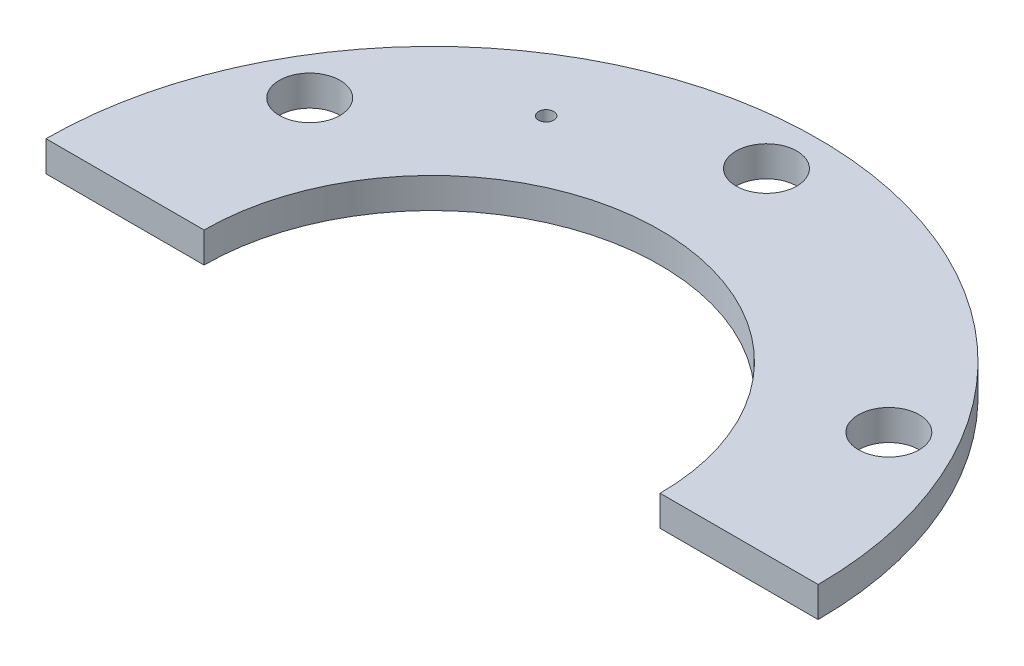
ISO-10303-21;
HEADER;
FILE_DESCRIPTION(('STEP AP214'),'2;1');
FILE_NAME('part.step','',(''),(''),'','','');
FILE_SCHEMA(('AUTOMOTIVE_DESIGN { 1 0 10303 214 1 1 1 1 }'));
ENDSEC;
DATA;
#1=APPLICATION_CONTEXT('core data for automotive mechanical design processes');
#2=APPLICATION_PROTOCOL_DEFINITION('international standard','automotive_design',2000,#1);
#3=PRODUCT_CONTEXT('',#1,'mechanical');
#4=PRODUCT('Part','Part','',(#3));
#5=PRODUCT_RELATED_PRODUCT_CATEGORY('part','',(#4));
#6=PRODUCT_DEFINITION_FORMATION('','',#4);
#7=PRODUCT_DEFINITION_CONTEXT('part definition',#1,'design');
#8=PRODUCT_DEFINITION('design','',#6,#7);
#9=PRODUCT_DEFINITION_SHAPE('','',#8);
#10=(LENGTH_UNIT() NAMED_UNIT(*) SI_UNIT(.MILLI.,.METRE.));
#11=(NAMED_UNIT(*) PLANE_ANGLE_UNIT() SI_UNIT($,.RADIAN.));
#12=(NAMED_UNIT(*) SI_UNIT($,.STERADIAN.) SOLID_ANGLE_UNIT());
#13=UNCERTAINTY_MEASURE_WITH_UNIT(LENGTH_MEASURE(1.E-05),#10,'distance_accuracy_value','');
#14=(GEOMETRIC_REPRESENTATION_CONTEXT(3) GLOBAL_UNCERTAINTY_ASSIGNED_CONTEXT((#13)) GLOBAL_UNIT_ASSIGNED_CONTEXT((#10,
#11,#12)) REPRESENTATION_CONTEXT('',''));
#15=CARTESIAN_POINT('',(0.,0.,0.));
#16=DIRECTION('',(0.,0.,1.));
#17=DIRECTION('',(1.,0.,0.));
#18=AXIS2_PLACEMENT_3D('',#15,#16,#17);
#19=CARTESIAN_POINT('',(0.,1.,0.));
#20=DIRECTION('',(0.,-1.,0.));
#21=DIRECTION('',(0.,0.,-1.));
#22=AXIS2_PLACEMENT_3D('',#19,#20,#21);
#23=CYLINDRICAL_SURFACE('',#22,12.7);
#24=DIRECTION('',(0.,-1.,0.));
#25=VECTOR('',#24,1.);
#26=CARTESIAN_POINT('',(-12.7,1.,0.));
#27=LINE('',#26,#25);
#28=CARTESIAN_POINT('',(-12.7,1.,0.));
#29=VERTEX_POINT('',#28);
#30=CARTESIAN_POINT('',(-12.7,0.,0.));
#31=VERTEX_POINT('',#30);
#32=EDGE_CURVE('E84',#29,#31,#27,.T.);
#33=ORIENTED_EDGE('',*,*,#32,.F.);
#34=CARTESIAN_POINT('',(0.,1.,0.));
#35=DIRECTION('',(0.,1.,0.));
#36=DIRECTION('',(0.,0.,1.));
#37=AXIS2_PLACEMENT_3D('',#34,#35,#36);
#38=CIRCLE('',#37,12.7);
#39=CARTESIAN_POINT('',(12.7,1.,0.));
#40=VERTEX_POINT('',#39);
#41=EDGE_CURVE('E77',#40,#29,#38,.T.);
#42=ORIENTED_EDGE('',*,*,#41,.F.);
#43=DIRECTION('',(0.,-1.,0.));
#44=VECTOR('',#43,1.);
#45=CARTESIAN_POINT('',(12.7,1.,0.));
#46=LINE('',#45,#44);
#47=CARTESIAN_POINT('',(12.7,0.,0.));
#48=VERTEX_POINT('',#47);
#49=EDGE_CURVE('E93',#48,#40,#46,.F.);
#50=ORIENTED_EDGE('',*,*,#49,.F.);
#51=CARTESIAN_POINT('',(0.,0.,0.));
#52=DIRECTION('',(0.,1.,0.));
#53=DIRECTION('',(0.,0.,1.));
#54=AXIS2_PLACEMENT_3D('',#51,#52,#53);
#55=CIRCLE('',#54,12.7);
#56=EDGE_CURVE('E111',#48,#31,#55,.T.);
#57=ORIENTED_EDGE('',*,*,#56,.T.);
#58=EDGE_LOOP('',(#33,#42,#50,#57));
#59=FACE_BOUND('',#58,.T.);
#60=ADVANCED_FACE('F33',(#59),#23,.T.);
#61=CARTESIAN_POINT('',(0.,1.,0.));
#62=DIRECTION('',(0.,1.,0.));
#63=DIRECTION('',(0.,0.,1.));
#64=AXIS2_PLACEMENT_3D('',#61,#62,#63);
#65=PLANE('',#64);
#66=CARTESIAN_POINT('',(-5.12500000000038,1.,-8.87676038879028));
#67=DIRECTION('',(0.,1.,0.));
#68=DIRECTION('',(0.,0.,1.));
#69=AXIS2_PLACEMENT_3D('',#66,#67,#68);
#70=CIRCLE('',#69,0.25);
#71=CARTESIAN_POINT('',(-5.12500000000038,1.,-8.62676038879028));
#72=VERTEX_POINT('',#71);
#73=EDGE_CURVE('E121',#72,#72,#70,.T.);
#74=ORIENTED_EDGE('',*,*,#73,.F.);
#75=EDGE_LOOP('',(#74));
#76=FACE_BOUND('',#75,.T.);
#77=CARTESIAN_POINT('',(-9.5262794416286,1.,-5.49999999999959));
#78=DIRECTION('',(0.,1.,0.));
#79=DIRECTION('',(0.,0.,1.));
#80=AXIS2_PLACEMENT_3D('',#77,#78,#79);
#81=CIRCLE('',#80,1.00000000000047);
#82=CARTESIAN_POINT('',(-9.5262794416286,1.,-4.49999999999912));
#83=VERTEX_POINT('',#82);
#84=EDGE_CURVE('E100',#83,#83,#81,.T.);
#85=ORIENTED_EDGE('',*,*,#84,.F.);
#86=EDGE_LOOP('',(#85));
#87=FACE_BOUND('',#86,.T.);
#88=CARTESIAN_POINT('',(9.52627944162914,1.,-5.50000000000035));
#89=DIRECTION('',(0.,1.,0.));
#90=DIRECTION('',(0.,0.,1.));
#91=AXIS2_PLACEMENT_3D('',#88,#89,#90);
#92=CIRCLE('',#91,1.00000000000019);
#93=CARTESIAN_POINT('',(9.52627944162914,1.,-4.50000000000015));
#94=VERTEX_POINT('',#93);
#95=EDGE_CURVE('E105',#94,#94,#92,.T.);
#96=ORIENTED_EDGE('',*,*,#95,.F.);
#97=EDGE_LOOP('',(#96));
#98=FACE_BOUND('',#97,.T.);
#99=CARTESIAN_POINT('',(0.,1.,-11.));
#100=DIRECTION('',(0.,1.,0.));
#101=DIRECTION('',(0.,0.,1.));
#102=AXIS2_PLACEMENT_3D('',#99,#100,#101);
#103=CIRCLE('',#102,1.);
#104=CARTESIAN_POINT('',(0.,1.,-10.));
#105=VERTEX_POINT('',#104);
#106=EDGE_CURVE('E108',#105,#105,#103,.T.);
#107=ORIENTED_EDGE('',*,*,#106,.F.);
#108=EDGE_LOOP('',(#107));
#109=FACE_BOUND('',#108,.T.);
#110=ORIENTED_EDGE('',*,*,#41,.T.);
#111=DIRECTION('',(1.,0.,0.));
#112=VECTOR('',#111,1.);
#113=CARTESIAN_POINT('',(0.,1.,0.));
#114=LINE('',#113,#112);
#115=CARTESIAN_POINT('',(-7.5,1.,0.));
#116=VERTEX_POINT('',#115);
#117=EDGE_CURVE('E71',#29,#116,#114,.T.);
#118=ORIENTED_EDGE('',*,*,#117,.T.);
#119=CARTESIAN_POINT('',(0.,1.,0.));
#120=DIRECTION('',(0.,1.,0.));
#121=DIRECTION('',(0.,0.,1.));
#122=AXIS2_PLACEMENT_3D('',#119,#120,#121);
#123=CIRCLE('',#122,7.5);
#124=CARTESIAN_POINT('',(7.5,1.,0.));
#125=VERTEX_POINT('',#124);
#126=EDGE_CURVE('E82',#125,#116,#123,.T.);
#127=ORIENTED_EDGE('',*,*,#126,.F.);
#128=EDGE_CURVE('E54',#125,#40,#114,.T.);
#129=ORIENTED_EDGE('',*,*,#128,.T.);
#130=EDGE_LOOP('',(#110,#118,#127,#129));
#131=FACE_BOUND('',#130,.T.);
#132=ADVANCED_FACE('F81',(#76,#87,#98,#109,#131),#65,.T.);
#133=CARTESIAN_POINT('',(0.,0.,0.));
#134=DIRECTION('',(0.,1.,0.));
#135=DIRECTION('',(0.,0.,1.));
#136=AXIS2_PLACEMENT_3D('',#133,#134,#135);
#137=PLANE('',#136);
#138=CARTESIAN_POINT('',(-5.12500000000038,0.,-8.87676038879028));
#139=DIRECTION('',(0.,1.,0.));
#140=DIRECTION('',(0.,0.,1.));
#141=AXIS2_PLACEMENT_3D('',#138,#139,#140);
#142=CIRCLE('',#141,0.25);
#143=CARTESIAN_POINT('',(-5.12500000000038,0.,-8.62676038879028));
#144=VERTEX_POINT('',#143);
#145=EDGE_CURVE('E124',#144,#144,#142,.T.);
#146=ORIENTED_EDGE('',*,*,#145,.T.);
#147=EDGE_LOOP('',(#146));
#148=FACE_BOUND('',#147,.T.);
#149=CARTESIAN_POINT('',(-9.5262794416286,0.,-5.49999999999959));
#150=DIRECTION('',(0.,1.,0.));
#151=DIRECTION('',(0.,0.,1.));
#152=AXIS2_PLACEMENT_3D('',#149,#150,#151);
#153=CIRCLE('',#152,1.00000000000047);
#154=CARTESIAN_POINT('',(-9.5262794416286,0.,-4.49999999999912));
#155=VERTEX_POINT('',#154);
#156=EDGE_CURVE('E91',#155,#155,#153,.T.);
#157=ORIENTED_EDGE('',*,*,#156,.T.);
#158=EDGE_LOOP('',(#157));
#159=FACE_BOUND('',#158,.T.);
#160=CARTESIAN_POINT('',(9.52627944162914,0.,-5.50000000000035));
#161=DIRECTION('',(0.,1.,0.));
#162=DIRECTION('',(0.,0.,1.));
#163=AXIS2_PLACEMENT_3D('',#160,#161,#162);
#164=CIRCLE('',#163,1.00000000000019);
#165=CARTESIAN_POINT('',(9.52627944162914,0.,-4.50000000000015));
#166=VERTEX_POINT('',#165);
#167=EDGE_CURVE('E87',#166,#166,#164,.T.);
#168=ORIENTED_EDGE('',*,*,#167,.T.);
#169=EDGE_LOOP('',(#168));
#170=FACE_BOUND('',#169,.T.);
#171=CARTESIAN_POINT('',(0.,0.,-11.));
#172=DIRECTION('',(0.,1.,0.));
#173=DIRECTION('',(0.,0.,1.));
#174=AXIS2_PLACEMENT_3D('',#171,#172,#173);
#175=CIRCLE('',#174,1.);
#176=CARTESIAN_POINT('',(0.,0.,-10.));
#177=VERTEX_POINT('',#176);
#178=EDGE_CURVE('E97',#177,#177,#175,.T.);
#179=ORIENTED_EDGE('',*,*,#178,.T.);
#180=EDGE_LOOP('',(#179));
#181=FACE_BOUND('',#180,.T.);
#182=DIRECTION('',(1.,0.,0.));
#183=VECTOR('',#182,1.);
#184=CARTESIAN_POINT('',(0.,0.,0.));
#185=LINE('',#184,#183);
#186=CARTESIAN_POINT('',(-7.5,0.,0.));
#187=VERTEX_POINT('',#186);
#188=EDGE_CURVE('E47',#31,#187,#185,.T.);
#189=ORIENTED_EDGE('',*,*,#188,.F.);
#190=ORIENTED_EDGE('',*,*,#56,.F.);
#191=CARTESIAN_POINT('',(7.5,0.,0.));
#192=VERTEX_POINT('',#191);
#193=EDGE_CURVE('E120',#192,#48,#185,.T.);
#194=ORIENTED_EDGE('',*,*,#193,.F.);
#195=CARTESIAN_POINT('',(0.,0.,0.));
#196=DIRECTION('',(0.,1.,0.));
#197=DIRECTION('',(0.,0.,1.));
#198=AXIS2_PLACEMENT_3D('',#195,#196,#197);
#199=CIRCLE('',#198,7.5);
#200=EDGE_CURVE('E88',#192,#187,#199,.T.);
#201=ORIENTED_EDGE('',*,*,#200,.T.);
#202=EDGE_LOOP('',(#189,#190,#194,#201));
#203=FACE_BOUND('',#202,.T.);
#204=ADVANCED_FACE('F119',(#148,#159,#170,#181,#203),#137,.F.);
#205=CARTESIAN_POINT('',(0.,0.,0.));
#206=DIRECTION('',(0.,1.,0.));
#207=DIRECTION('',(0.,0.,1.));
#208=AXIS2_PLACEMENT_3D('',#205,#206,#207);
#209=CYLINDRICAL_SURFACE('',#208,7.5);
#210=DIRECTION('',(0.,1.,0.));
#211=VECTOR('',#210,1.);
#212=CARTESIAN_POINT('',(7.5,0.,0.));
#213=LINE('',#212,#211);
#214=EDGE_CURVE('E11',#125,#192,#213,.F.);
#215=ORIENTED_EDGE('',*,*,#214,.F.);
#216=ORIENTED_EDGE('',*,*,#126,.T.);
#217=DIRECTION('',(0.,1.,0.));
#218=VECTOR('',#217,1.);
#219=CARTESIAN_POINT('',(-7.5,0.,0.));
#220=LINE('',#219,#218);
#221=EDGE_CURVE('E40',#187,#116,#220,.T.);
#222=ORIENTED_EDGE('',*,*,#221,.F.);
#223=ORIENTED_EDGE('',*,*,#200,.F.);
#224=EDGE_LOOP('',(#215,#216,#222,#223));
#225=FACE_BOUND('',#224,.T.);
#226=ADVANCED_FACE('F86',(#225),#209,.F.);
#227=CARTESIAN_POINT('',(-9.5262794416286,0.,-5.49999999999959));
#228=DIRECTION('',(0.,1.,0.));
#229=DIRECTION('',(0.,0.,1.));
#230=AXIS2_PLACEMENT_3D('',#227,#228,#229);
#231=CYLINDRICAL_SURFACE('',#230,1.00000000000047);
#232=ORIENTED_EDGE('',*,*,#84,.T.);
#233=EDGE_LOOP('',(#232));
#234=FACE_BOUND('',#233,.T.);
#235=ORIENTED_EDGE('',*,*,#156,.F.);
#236=EDGE_LOOP('',(#235));
#237=FACE_BOUND('',#236,.T.);
#238=ADVANCED_FACE('F155',(#234,#237),#231,.F.);
#239=CARTESIAN_POINT('',(9.52627944162914,0.,-5.50000000000035));
#240=DIRECTION('',(0.,1.,0.));
#241=DIRECTION('',(0.,0.,1.));
#242=AXIS2_PLACEMENT_3D('',#239,#240,#241);
#243=CYLINDRICAL_SURFACE('',#242,1.00000000000019);
#244=ORIENTED_EDGE('',*,*,#95,.T.);
#245=EDGE_LOOP('',(#244));
#246=FACE_BOUND('',#245,.T.);
#247=ORIENTED_EDGE('',*,*,#167,.F.);
#248=EDGE_LOOP('',(#247));
#249=FACE_BOUND('',#248,.T.);
#250=ADVANCED_FACE('F152',(#246,#249),#243,.F.);
#251=CARTESIAN_POINT('',(0.,0.,-11.));
#252=DIRECTION('',(0.,1.,0.));
#253=DIRECTION('',(0.,0.,1.));
#254=AXIS2_PLACEMENT_3D('',#251,#252,#253);
#255=CYLINDRICAL_SURFACE('',#254,1.);
#256=ORIENTED_EDGE('',*,*,#106,.T.);
#257=EDGE_LOOP('',(#256));
#258=FACE_BOUND('',#257,.T.);
#259=ORIENTED_EDGE('',*,*,#178,.F.);
#260=EDGE_LOOP('',(#259));
#261=FACE_BOUND('',#260,.T.);
#262=ADVANCED_FACE('F137',(#258,#261),#255,.F.);
#263=CARTESIAN_POINT('',(0.,0.,0.));
#264=DIRECTION('',(0.,0.,1.));
#265=DIRECTION('',(1.,0.,0.));
#266=AXIS2_PLACEMENT_3D('',#263,#264,#265);
#267=PLANE('',#266);
#268=ORIENTED_EDGE('',*,*,#32,.T.);
#269=ORIENTED_EDGE('',*,*,#188,.T.);
#270=ORIENTED_EDGE('',*,*,#221,.T.);
#271=ORIENTED_EDGE('',*,*,#117,.F.);
#272=EDGE_LOOP('',(#268,#269,#270,#271));
#273=FACE_BOUND('',#272,.T.);
#274=ADVANCED_FACE('F70',(#273),#267,.T.);
#275=ORIENTED_EDGE('',*,*,#49,.T.);
#276=ORIENTED_EDGE('',*,*,#128,.F.);
#277=ORIENTED_EDGE('',*,*,#214,.T.);
#278=ORIENTED_EDGE('',*,*,#193,.T.);
#279=EDGE_LOOP('',(#275,#276,#277,#278));
#280=FACE_BOUND('',#279,.T.);
#281=ADVANCED_FACE('F127',(#280),#267,.T.);
#282=CARTESIAN_POINT('',(-5.12500000000038,0.,-8.87676038879028));
#283=DIRECTION('',(0.,1.,0.));
#284=DIRECTION('',(0.,0.,1.));
#285=AXIS2_PLACEMENT_3D('',#282,#283,#284);
#286=CYLINDRICAL_SURFACE('',#285,0.25);
#287=ORIENTED_EDGE('',*,*,#73,.T.);
#288=EDGE_LOOP('',(#287));
#289=FACE_BOUND('',#288,.T.);
#290=ORIENTED_EDGE('',*,*,#145,.F.);
#291=EDGE_LOOP('',(#290));
#292=FACE_BOUND('',#291,.T.);
#293=ADVANCED_FACE('F129',(#289,#292),#286,.F.);
#294=CLOSED_SHELL('',(#60,#132,#204,#226,#238,#250,#262,#274,#281,#293));
#295=MANIFOLD_SOLID_BREP('B2',#294);
#296=ADVANCED_BREP_SHAPE_REPRESENTATION('',(#18,#295),#14);
#297=SHAPE_DEFINITION_REPRESENTATION(#9,#296);
ENDSEC;
END-ISO-10303-21;
